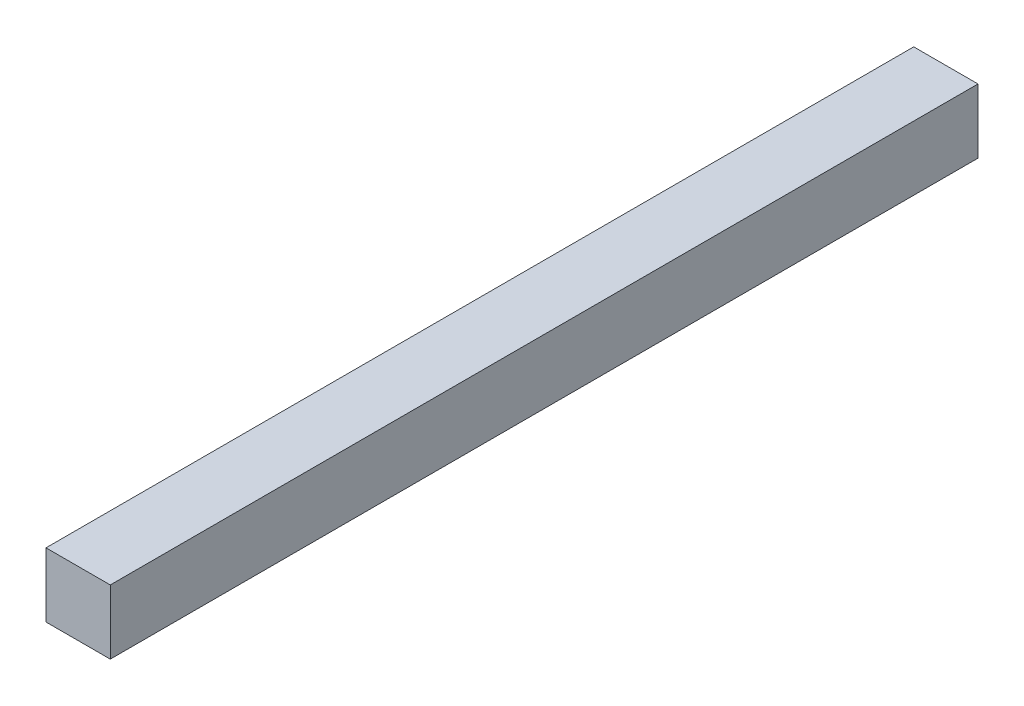
ISO-10303-21;
HEADER;
FILE_DESCRIPTION(('STEP AP214'),'2;1');
FILE_NAME('part.step','',(''),(''),'','','');
FILE_SCHEMA(('AUTOMOTIVE_DESIGN { 1 0 10303 214 1 1 1 1 }'));
ENDSEC;
DATA;
#1=APPLICATION_CONTEXT('core data for automotive mechanical design processes');
#2=APPLICATION_PROTOCOL_DEFINITION('international standard','automotive_design',2000,#1);
#3=PRODUCT_CONTEXT('',#1,'mechanical');
#4=PRODUCT('Part','Part','',(#3));
#5=PRODUCT_RELATED_PRODUCT_CATEGORY('part','',(#4));
#6=PRODUCT_DEFINITION_FORMATION('','',#4);
#7=PRODUCT_DEFINITION_CONTEXT('part definition',#1,'design');
#8=PRODUCT_DEFINITION('design','',#6,#7);
#9=PRODUCT_DEFINITION_SHAPE('','',#8);
#10=(LENGTH_UNIT() NAMED_UNIT(*) SI_UNIT(.MILLI.,.METRE.));
#11=(NAMED_UNIT(*) PLANE_ANGLE_UNIT() SI_UNIT($,.RADIAN.));
#12=(NAMED_UNIT(*) SI_UNIT($,.STERADIAN.) SOLID_ANGLE_UNIT());
#13=UNCERTAINTY_MEASURE_WITH_UNIT(LENGTH_MEASURE(1.E-05),#10,'distance_accuracy_value','');
#14=(GEOMETRIC_REPRESENTATION_CONTEXT(3) GLOBAL_UNCERTAINTY_ASSIGNED_CONTEXT((#13)) GLOBAL_UNIT_ASSIGNED_CONTEXT((#10,
#11,#12)) REPRESENTATION_CONTEXT('',''));
#15=CARTESIAN_POINT('',(0.,0.,0.));
#16=DIRECTION('',(0.,0.,1.));
#17=DIRECTION('',(1.,0.,0.));
#18=AXIS2_PLACEMENT_3D('',#15,#16,#17);
#19=CARTESIAN_POINT('',(10.,-10.,270.));
#20=DIRECTION('',(-1.,0.,0.));
#21=DIRECTION('',(0.,0.,1.));
#22=AXIS2_PLACEMENT_3D('',#19,#20,#21);
#23=PLANE('',#22);
#24=DIRECTION('',(0.,1.,0.));
#25=VECTOR('',#24,1.);
#26=CARTESIAN_POINT('',(10.,-10.,0.));
#27=LINE('',#26,#25);
#28=CARTESIAN_POINT('',(10.,-10.,0.));
#29=VERTEX_POINT('',#28);
#30=CARTESIAN_POINT('',(10.,10.,0.));
#31=VERTEX_POINT('',#30);
#32=EDGE_CURVE('E96',#29,#31,#27,.T.);
#33=ORIENTED_EDGE('',*,*,#32,.T.);
#34=DIRECTION('',(0.,0.,-1.));
#35=VECTOR('',#34,1.);
#36=CARTESIAN_POINT('',(10.,10.,270.));
#37=LINE('',#36,#35);
#38=CARTESIAN_POINT('',(10.,10.,270.));
#39=VERTEX_POINT('',#38);
#40=EDGE_CURVE('E11',#39,#31,#37,.T.);
#41=ORIENTED_EDGE('',*,*,#40,.F.);
#42=DIRECTION('',(0.,1.,0.));
#43=VECTOR('',#42,1.);
#44=CARTESIAN_POINT('',(10.,-10.,270.));
#45=LINE('',#44,#43);
#46=CARTESIAN_POINT('',(10.,-10.,270.));
#47=VERTEX_POINT('',#46);
#48=EDGE_CURVE('E84',#47,#39,#45,.T.);
#49=ORIENTED_EDGE('',*,*,#48,.F.);
#50=DIRECTION('',(0.,0.,-1.));
#51=VECTOR('',#50,1.);
#52=CARTESIAN_POINT('',(10.,-10.,270.));
#53=LINE('',#52,#51);
#54=EDGE_CURVE('E92',#47,#29,#53,.T.);
#55=ORIENTED_EDGE('',*,*,#54,.T.);
#56=EDGE_LOOP('',(#33,#41,#49,#55));
#57=FACE_BOUND('',#56,.T.);
#58=ADVANCED_FACE('F33',(#57),#23,.F.);
#59=CARTESIAN_POINT('',(-10.,10.,270.));
#60=DIRECTION('',(0.,-1.,0.));
#61=DIRECTION('',(0.,0.,-1.));
#62=AXIS2_PLACEMENT_3D('',#59,#60,#61);
#63=PLANE('',#62);
#64=DIRECTION('',(-1.,0.,0.));
#65=VECTOR('',#64,1.);
#66=CARTESIAN_POINT('',(-10.,10.,0.));
#67=LINE('',#66,#65);
#68=CARTESIAN_POINT('',(-10.,10.,0.));
#69=VERTEX_POINT('',#68);
#70=EDGE_CURVE('E88',#31,#69,#67,.T.);
#71=ORIENTED_EDGE('',*,*,#70,.T.);
#72=DIRECTION('',(0.,0.,-1.));
#73=VECTOR('',#72,1.);
#74=CARTESIAN_POINT('',(-10.,10.,270.));
#75=LINE('',#74,#73);
#76=CARTESIAN_POINT('',(-10.,10.,270.));
#77=VERTEX_POINT('',#76);
#78=EDGE_CURVE('E41',#77,#69,#75,.T.);
#79=ORIENTED_EDGE('',*,*,#78,.F.);
#80=DIRECTION('',(-1.,0.,0.));
#81=VECTOR('',#80,1.);
#82=CARTESIAN_POINT('',(-10.,10.,270.));
#83=LINE('',#82,#81);
#84=EDGE_CURVE('E79',#39,#77,#83,.T.);
#85=ORIENTED_EDGE('',*,*,#84,.F.);
#86=ORIENTED_EDGE('',*,*,#40,.T.);
#87=EDGE_LOOP('',(#71,#79,#85,#86));
#88=FACE_BOUND('',#87,.T.);
#89=ADVANCED_FACE('F87',(#88),#63,.F.);
#90=CARTESIAN_POINT('',(-10.,-10.,270.));
#91=DIRECTION('',(1.,0.,0.));
#92=DIRECTION('',(0.,0.,-1.));
#93=AXIS2_PLACEMENT_3D('',#90,#91,#92);
#94=PLANE('',#93);
#95=DIRECTION('',(0.,-1.,0.));
#96=VECTOR('',#95,1.);
#97=CARTESIAN_POINT('',(-10.,-10.,0.));
#98=LINE('',#97,#96);
#99=CARTESIAN_POINT('',(-10.,-10.,0.));
#100=VERTEX_POINT('',#99);
#101=EDGE_CURVE('E66',#69,#100,#98,.T.);
#102=ORIENTED_EDGE('',*,*,#101,.T.);
#103=DIRECTION('',(0.,0.,-1.));
#104=VECTOR('',#103,1.);
#105=CARTESIAN_POINT('',(-10.,-10.,270.));
#106=LINE('',#105,#104);
#107=CARTESIAN_POINT('',(-10.,-10.,270.));
#108=VERTEX_POINT('',#107);
#109=EDGE_CURVE('E89',#108,#100,#106,.T.);
#110=ORIENTED_EDGE('',*,*,#109,.F.);
#111=DIRECTION('',(0.,-1.,0.));
#112=VECTOR('',#111,1.);
#113=CARTESIAN_POINT('',(-10.,-10.,270.));
#114=LINE('',#113,#112);
#115=EDGE_CURVE('E82',#77,#108,#114,.T.);
#116=ORIENTED_EDGE('',*,*,#115,.F.);
#117=ORIENTED_EDGE('',*,*,#78,.T.);
#118=EDGE_LOOP('',(#102,#110,#116,#117));
#119=FACE_BOUND('',#118,.T.);
#120=ADVANCED_FACE('F90',(#119),#94,.F.);
#121=CARTESIAN_POINT('',(-10.,-10.,270.));
#122=DIRECTION('',(0.,1.,0.));
#123=DIRECTION('',(0.,0.,1.));
#124=AXIS2_PLACEMENT_3D('',#121,#122,#123);
#125=PLANE('',#124);
#126=DIRECTION('',(1.,0.,0.));
#127=VECTOR('',#126,1.);
#128=CARTESIAN_POINT('',(-10.,-10.,0.));
#129=LINE('',#128,#127);
#130=EDGE_CURVE('E72',#100,#29,#129,.T.);
#131=ORIENTED_EDGE('',*,*,#130,.T.);
#132=ORIENTED_EDGE('',*,*,#54,.F.);
#133=DIRECTION('',(1.,0.,0.));
#134=VECTOR('',#133,1.);
#135=CARTESIAN_POINT('',(-10.,-10.,270.));
#136=LINE('',#135,#134);
#137=EDGE_CURVE('E49',#108,#47,#136,.T.);
#138=ORIENTED_EDGE('',*,*,#137,.F.);
#139=ORIENTED_EDGE('',*,*,#109,.T.);
#140=EDGE_LOOP('',(#131,#132,#138,#139));
#141=FACE_BOUND('',#140,.T.);
#142=ADVANCED_FACE('F103',(#141),#125,.F.);
#143=CARTESIAN_POINT('',(0.,0.,270.));
#144=DIRECTION('',(0.,0.,-1.));
#145=DIRECTION('',(-1.,0.,0.));
#146=AXIS2_PLACEMENT_3D('',#143,#144,#145);
#147=PLANE('',#146);
#148=ORIENTED_EDGE('',*,*,#48,.T.);
#149=ORIENTED_EDGE('',*,*,#84,.T.);
#150=ORIENTED_EDGE('',*,*,#115,.T.);
#151=ORIENTED_EDGE('',*,*,#137,.T.);
#152=EDGE_LOOP('',(#148,#149,#150,#151));
#153=FACE_BOUND('',#152,.T.);
#154=ADVANCED_FACE('F80',(#153),#147,.F.);
#155=CARTESIAN_POINT('',(0.,0.,0.));
#156=DIRECTION('',(0.,0.,-1.));
#157=DIRECTION('',(-1.,0.,0.));
#158=AXIS2_PLACEMENT_3D('',#155,#156,#157);
#159=PLANE('',#158);
#160=ORIENTED_EDGE('',*,*,#32,.F.);
#161=ORIENTED_EDGE('',*,*,#130,.F.);
#162=ORIENTED_EDGE('',*,*,#101,.F.);
#163=ORIENTED_EDGE('',*,*,#70,.F.);
#164=EDGE_LOOP('',(#160,#161,#162,#163));
#165=FACE_BOUND('',#164,.T.);
#166=ADVANCED_FACE('F106',(#165),#159,.T.);
#167=CLOSED_SHELL('',(#58,#89,#120,#142,#154,#166));
#168=MANIFOLD_SOLID_BREP('B2',#167);
#169=ADVANCED_BREP_SHAPE_REPRESENTATION('',(#18,#168),#14);
#170=SHAPE_DEFINITION_REPRESENTATION(#9,#169);
ENDSEC;
END-ISO-10303-21;
